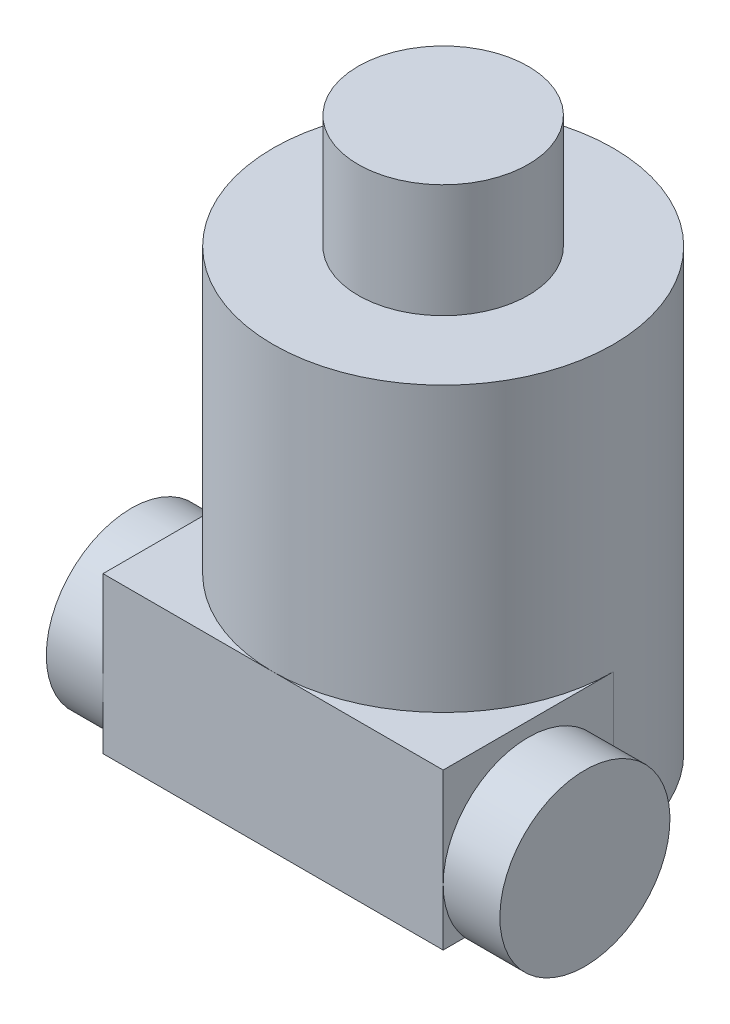
ISO-10303-21;
HEADER;
FILE_DESCRIPTION(('STEP AP214'),'2;1');
FILE_NAME('part.step','',(''),(''),'','','');
FILE_SCHEMA(('AUTOMOTIVE_DESIGN { 1 0 10303 214 1 1 1 1 }'));
ENDSEC;
DATA;
#1=APPLICATION_CONTEXT('core data for automotive mechanical design processes');
#2=APPLICATION_PROTOCOL_DEFINITION('international standard','automotive_design',2000,#1);
#3=PRODUCT_CONTEXT('',#1,'mechanical');
#4=PRODUCT('Part','Part','',(#3));
#5=PRODUCT_RELATED_PRODUCT_CATEGORY('part','',(#4));
#6=PRODUCT_DEFINITION_FORMATION('','',#4);
#7=PRODUCT_DEFINITION_CONTEXT('part definition',#1,'design');
#8=PRODUCT_DEFINITION('design','',#6,#7);
#9=PRODUCT_DEFINITION_SHAPE('','',#8);
#10=(LENGTH_UNIT() NAMED_UNIT(*) SI_UNIT(.MILLI.,.METRE.));
#11=(NAMED_UNIT(*) PLANE_ANGLE_UNIT() SI_UNIT($,.RADIAN.));
#12=(NAMED_UNIT(*) SI_UNIT($,.STERADIAN.) SOLID_ANGLE_UNIT());
#13=UNCERTAINTY_MEASURE_WITH_UNIT(LENGTH_MEASURE(1.E-05),#10,'distance_accuracy_value','');
#14=(GEOMETRIC_REPRESENTATION_CONTEXT(3) GLOBAL_UNCERTAINTY_ASSIGNED_CONTEXT((#13)) GLOBAL_UNIT_ASSIGNED_CONTEXT((#10,
#11,#12)) REPRESENTATION_CONTEXT('',''));
#15=CARTESIAN_POINT('',(0.,0.,0.));
#16=DIRECTION('',(0.,0.,1.));
#17=DIRECTION('',(1.,0.,0.));
#18=AXIS2_PLACEMENT_3D('',#15,#16,#17);
#19=CARTESIAN_POINT('',(60.,55.,0.));
#20=DIRECTION('',(1.,0.,0.));
#21=DIRECTION('',(0.,1.,0.));
#22=AXIS2_PLACEMENT_3D('',#19,#20,#21);
#23=PLANE('',#22);
#24=CARTESIAN_POINT('',(60.,20.,30.));
#25=DIRECTION('',(-1.,0.,0.));
#26=DIRECTION('',(0.,-1.,0.));
#27=AXIS2_PLACEMENT_3D('',#24,#25,#26);
#28=CIRCLE('',#27,30.);
#29=CARTESIAN_POINT('',(60.,0.,52.3606797749979));
#30=VERTEX_POINT('',#29);
#31=CARTESIAN_POINT('',(60.,20.,60.));
#32=VERTEX_POINT('',#31);
#33=EDGE_CURVE('E129',#30,#32,#28,.T.);
#34=ORIENTED_EDGE('',*,*,#33,.T.);
#35=DIRECTION('',(0.,-1.,0.));
#36=VECTOR('',#35,1.);
#37=CARTESIAN_POINT('',(60.,55.,60.));
#38=LINE('',#37,#36);
#39=CARTESIAN_POINT('',(60.,0.,60.));
#40=VERTEX_POINT('',#39);
#41=EDGE_CURVE('E119',#32,#40,#38,.T.);
#42=ORIENTED_EDGE('',*,*,#41,.T.);
#43=DIRECTION('',(0.,0.,1.));
#44=VECTOR('',#43,1.);
#45=CARTESIAN_POINT('',(60.,0.,0.));
#46=LINE('',#45,#44);
#47=EDGE_CURVE('E64',#30,#40,#46,.T.);
#48=ORIENTED_EDGE('',*,*,#47,.F.);
#49=EDGE_LOOP('',(#34,#42,#48));
#50=FACE_BOUND('',#49,.T.);
#51=ADVANCED_FACE('F41',(#50),#23,.T.);
#52=CARTESIAN_POINT('',(60.,20.,30.));
#53=DIRECTION('',(1.,0.,0.));
#54=DIRECTION('',(0.,1.,0.));
#55=AXIS2_PLACEMENT_3D('',#52,#53,#54);
#56=CIRCLE('',#55,30.);
#57=CARTESIAN_POINT('',(60.,0.,7.63932022500209));
#58=VERTEX_POINT('',#57);
#59=CARTESIAN_POINT('',(60.,20.,0.));
#60=VERTEX_POINT('',#59);
#61=EDGE_CURVE('E11',#58,#60,#56,.T.);
#62=ORIENTED_EDGE('',*,*,#61,.F.);
#63=CARTESIAN_POINT('',(60.,0.,0.));
#64=VERTEX_POINT('',#63);
#65=EDGE_CURVE('E185',#64,#58,#46,.T.);
#66=ORIENTED_EDGE('',*,*,#65,.F.);
#67=DIRECTION('',(0.,-1.,0.));
#68=VECTOR('',#67,1.);
#69=CARTESIAN_POINT('',(60.,55.,0.));
#70=LINE('',#69,#68);
#71=EDGE_CURVE('E175',#60,#64,#70,.T.);
#72=ORIENTED_EDGE('',*,*,#71,.F.);
#73=EDGE_LOOP('',(#62,#66,#72));
#74=FACE_BOUND('',#73,.T.);
#75=ADVANCED_FACE('F259',(#74),#23,.T.);
#76=CARTESIAN_POINT('',(-60.,55.,0.));
#77=DIRECTION('',(-1.,0.,0.));
#78=DIRECTION('',(0.,-1.,0.));
#79=AXIS2_PLACEMENT_3D('',#76,#77,#78);
#80=PLANE('',#79);
#81=DIRECTION('',(0.,0.,-1.));
#82=VECTOR('',#81,1.);
#83=CARTESIAN_POINT('',(-60.,0.,0.));
#84=LINE('',#83,#82);
#85=CARTESIAN_POINT('',(-60.,0.,7.63932022500209));
#86=VERTEX_POINT('',#85);
#87=CARTESIAN_POINT('',(-60.,0.,0.));
#88=VERTEX_POINT('',#87);
#89=EDGE_CURVE('E195',#86,#88,#84,.T.);
#90=ORIENTED_EDGE('',*,*,#89,.F.);
#91=CARTESIAN_POINT('',(-60.,20.,30.));
#92=DIRECTION('',(-1.,0.,0.));
#93=DIRECTION('',(0.,-1.,0.));
#94=AXIS2_PLACEMENT_3D('',#91,#92,#93);
#95=CIRCLE('',#94,30.);
#96=CARTESIAN_POINT('',(-60.,20.,0.));
#97=VERTEX_POINT('',#96);
#98=EDGE_CURVE('E138',#86,#97,#95,.F.);
#99=ORIENTED_EDGE('',*,*,#98,.T.);
#100=DIRECTION('',(0.,-1.,0.));
#101=VECTOR('',#100,1.);
#102=CARTESIAN_POINT('',(-60.,55.,0.));
#103=LINE('',#102,#101);
#104=EDGE_CURVE('E176',#97,#88,#103,.T.);
#105=ORIENTED_EDGE('',*,*,#104,.T.);
#106=EDGE_LOOP('',(#90,#99,#105));
#107=FACE_BOUND('',#106,.T.);
#108=ADVANCED_FACE('F255',(#107),#80,.T.);
#109=CARTESIAN_POINT('',(-60.,55.,0.));
#110=VERTEX_POINT('',#109);
#111=EDGE_CURVE('E171',#110,#97,#103,.T.);
#112=ORIENTED_EDGE('',*,*,#111,.T.);
#113=CARTESIAN_POINT('',(-60.,20.,60.));
#114=VERTEX_POINT('',#113);
#115=EDGE_CURVE('E141',#97,#114,#95,.F.);
#116=ORIENTED_EDGE('',*,*,#115,.T.);
#117=DIRECTION('',(0.,-1.,0.));
#118=VECTOR('',#117,1.);
#119=CARTESIAN_POINT('',(-60.,55.,60.));
#120=LINE('',#119,#118);
#121=CARTESIAN_POINT('',(-60.,55.,60.));
#122=VERTEX_POINT('',#121);
#123=EDGE_CURVE('E170',#122,#114,#120,.T.);
#124=ORIENTED_EDGE('',*,*,#123,.F.);
#125=DIRECTION('',(0.,0.,-1.));
#126=VECTOR('',#125,1.);
#127=CARTESIAN_POINT('',(-60.,55.,0.));
#128=LINE('',#127,#126);
#129=EDGE_CURVE('E184',#122,#110,#128,.T.);
#130=ORIENTED_EDGE('',*,*,#129,.T.);
#131=EDGE_LOOP('',(#112,#116,#124,#130));
#132=FACE_BOUND('',#131,.T.);
#133=ADVANCED_FACE('F252',(#132),#80,.T.);
#134=CARTESIAN_POINT('',(0.,0.,0.));
#135=DIRECTION('',(0.,-1.,0.));
#136=DIRECTION('',(1.,0.,0.));
#137=AXIS2_PLACEMENT_3D('',#134,#135,#136);
#138=PLANE('',#137);
#139=CARTESIAN_POINT('',(0.,0.,0.));
#140=DIRECTION('',(0.,1.,0.));
#141=DIRECTION('',(-1.,0.,0.));
#142=AXIS2_PLACEMENT_3D('',#139,#140,#141);
#143=CIRCLE('',#142,60.);
#144=EDGE_CURVE('E154',#64,#88,#143,.T.);
#145=ORIENTED_EDGE('',*,*,#144,.F.);
#146=ORIENTED_EDGE('',*,*,#65,.T.);
#147=EDGE_CURVE('E189',#58,#30,#46,.T.);
#148=ORIENTED_EDGE('',*,*,#147,.T.);
#149=ORIENTED_EDGE('',*,*,#47,.T.);
#150=DIRECTION('',(-1.,0.,0.));
#151=VECTOR('',#150,1.);
#152=CARTESIAN_POINT('',(-60.,0.,60.));
#153=LINE('',#152,#151);
#154=CARTESIAN_POINT('',(-60.,0.,60.));
#155=VERTEX_POINT('',#154);
#156=EDGE_CURVE('E125',#40,#155,#153,.T.);
#157=ORIENTED_EDGE('',*,*,#156,.T.);
#158=CARTESIAN_POINT('',(-60.,0.,52.3606797749979));
#159=VERTEX_POINT('',#158);
#160=EDGE_CURVE('E190',#155,#159,#84,.T.);
#161=ORIENTED_EDGE('',*,*,#160,.T.);
#162=EDGE_CURVE('E194',#159,#86,#84,.T.);
#163=ORIENTED_EDGE('',*,*,#162,.T.);
#164=ORIENTED_EDGE('',*,*,#89,.T.);
#165=EDGE_LOOP('',(#145,#146,#148,#149,#157,#161,#163,#164));
#166=FACE_BOUND('',#165,.T.);
#167=ADVANCED_FACE('F43',(#166),#138,.T.);
#168=CARTESIAN_POINT('',(0.,195.,0.));
#169=DIRECTION('',(0.,1.,0.));
#170=DIRECTION('',(-1.,0.,0.));
#171=AXIS2_PLACEMENT_3D('',#168,#169,#170);
#172=CYLINDRICAL_SURFACE('',#171,60.);
#173=ORIENTED_EDGE('',*,*,#111,.F.);
#174=CARTESIAN_POINT('',(0.,55.,0.));
#175=DIRECTION('',(0.,1.,0.));
#176=DIRECTION('',(-1.,0.,0.));
#177=AXIS2_PLACEMENT_3D('',#174,#175,#176);
#178=CIRCLE('',#177,60.);
#179=CARTESIAN_POINT('',(0.,55.,60.));
#180=VERTEX_POINT('',#179);
#181=EDGE_CURVE('E150',#180,#110,#178,.F.);
#182=ORIENTED_EDGE('',*,*,#181,.F.);
#183=CARTESIAN_POINT('',(60.,55.,0.));
#184=VERTEX_POINT('',#183);
#185=EDGE_CURVE('E148',#184,#180,#178,.F.);
#186=ORIENTED_EDGE('',*,*,#185,.F.);
#187=EDGE_CURVE('E127',#184,#60,#70,.T.);
#188=ORIENTED_EDGE('',*,*,#187,.T.);
#189=ORIENTED_EDGE('',*,*,#71,.T.);
#190=ORIENTED_EDGE('',*,*,#144,.T.);
#191=ORIENTED_EDGE('',*,*,#104,.F.);
#192=EDGE_LOOP('',(#173,#182,#186,#188,#189,#190,#191));
#193=FACE_BOUND('',#192,.T.);
#194=CARTESIAN_POINT('',(0.,155.,0.));
#195=DIRECTION('',(0.,1.,0.));
#196=DIRECTION('',(-1.,0.,0.));
#197=AXIS2_PLACEMENT_3D('',#194,#195,#196);
#198=CIRCLE('',#197,60.);
#199=CARTESIAN_POINT('',(-60.,155.,0.));
#200=VERTEX_POINT('',#199);
#201=EDGE_CURVE('E158',#200,#200,#198,.T.);
#202=ORIENTED_EDGE('',*,*,#201,.F.);
#203=EDGE_LOOP('',(#202));
#204=FACE_BOUND('',#203,.T.);
#205=ADVANCED_FACE('F253',(#193,#204),#172,.T.);
#206=CARTESIAN_POINT('',(-60.,155.,0.));
#207=DIRECTION('',(0.,1.,0.));
#208=DIRECTION('',(-1.,0.,0.));
#209=AXIS2_PLACEMENT_3D('',#206,#207,#208);
#210=PLANE('',#209);
#211=ORIENTED_EDGE('',*,*,#201,.T.);
#212=EDGE_LOOP('',(#211));
#213=FACE_BOUND('',#212,.T.);
#214=CARTESIAN_POINT('',(0.,155.,0.));
#215=DIRECTION('',(0.,1.,0.));
#216=DIRECTION('',(-1.,0.,0.));
#217=AXIS2_PLACEMENT_3D('',#214,#215,#216);
#218=CIRCLE('',#217,30.);
#219=CARTESIAN_POINT('',(-30.,155.,0.));
#220=VERTEX_POINT('',#219);
#221=EDGE_CURVE('E162',#220,#220,#218,.T.);
#222=ORIENTED_EDGE('',*,*,#221,.F.);
#223=EDGE_LOOP('',(#222));
#224=FACE_BOUND('',#223,.T.);
#225=ADVANCED_FACE('F285',(#213,#224),#210,.T.);
#226=CARTESIAN_POINT('',(0.,195.,0.));
#227=DIRECTION('',(0.,1.,0.));
#228=DIRECTION('',(-1.,0.,0.));
#229=AXIS2_PLACEMENT_3D('',#226,#227,#228);
#230=CYLINDRICAL_SURFACE('',#229,30.);
#231=ORIENTED_EDGE('',*,*,#221,.T.);
#232=EDGE_LOOP('',(#231));
#233=FACE_BOUND('',#232,.T.);
#234=CARTESIAN_POINT('',(0.,195.,0.));
#235=DIRECTION('',(0.,1.,0.));
#236=DIRECTION('',(-1.,0.,0.));
#237=AXIS2_PLACEMENT_3D('',#234,#235,#236);
#238=CIRCLE('',#237,30.);
#239=CARTESIAN_POINT('',(-30.,195.,0.));
#240=VERTEX_POINT('',#239);
#241=EDGE_CURVE('E166',#240,#240,#238,.T.);
#242=ORIENTED_EDGE('',*,*,#241,.F.);
#243=EDGE_LOOP('',(#242));
#244=FACE_BOUND('',#243,.T.);
#245=ADVANCED_FACE('F289',(#233,#244),#230,.T.);
#246=CARTESIAN_POINT('',(-30.,195.,0.));
#247=DIRECTION('',(0.,1.,0.));
#248=DIRECTION('',(-1.,0.,0.));
#249=AXIS2_PLACEMENT_3D('',#246,#247,#248);
#250=PLANE('',#249);
#251=ORIENTED_EDGE('',*,*,#241,.T.);
#252=EDGE_LOOP('',(#251));
#253=FACE_BOUND('',#252,.T.);
#254=ADVANCED_FACE('F294',(#253),#250,.T.);
#255=CARTESIAN_POINT('',(-60.,55.,60.));
#256=DIRECTION('',(0.,0.,1.));
#257=DIRECTION('',(1.,0.,0.));
#258=AXIS2_PLACEMENT_3D('',#255,#256,#257);
#259=PLANE('',#258);
#260=ORIENTED_EDGE('',*,*,#123,.T.);
#261=EDGE_CURVE('E118',#114,#155,#120,.T.);
#262=ORIENTED_EDGE('',*,*,#261,.T.);
#263=ORIENTED_EDGE('',*,*,#156,.F.);
#264=ORIENTED_EDGE('',*,*,#41,.F.);
#265=CARTESIAN_POINT('',(60.,55.,60.));
#266=VERTEX_POINT('',#265);
#267=EDGE_CURVE('E109',#266,#32,#38,.T.);
#268=ORIENTED_EDGE('',*,*,#267,.F.);
#269=DIRECTION('',(-1.,0.,0.));
#270=VECTOR('',#269,1.);
#271=CARTESIAN_POINT('',(-60.,55.,60.));
#272=LINE('',#271,#270);
#273=EDGE_CURVE('E196',#266,#180,#272,.T.);
#274=ORIENTED_EDGE('',*,*,#273,.T.);
#275=EDGE_CURVE('E199',#180,#122,#272,.T.);
#276=ORIENTED_EDGE('',*,*,#275,.T.);
#277=EDGE_LOOP('',(#260,#262,#263,#264,#268,#274,#276));
#278=FACE_BOUND('',#277,.T.);
#279=ADVANCED_FACE('F123',(#278),#259,.T.);
#280=CARTESIAN_POINT('',(0.,55.,0.));
#281=DIRECTION('',(0.,1.,0.));
#282=DIRECTION('',(-1.,0.,0.));
#283=AXIS2_PLACEMENT_3D('',#280,#281,#282);
#284=PLANE('',#283);
#285=DIRECTION('',(0.,0.,1.));
#286=VECTOR('',#285,1.);
#287=CARTESIAN_POINT('',(60.,55.,0.));
#288=LINE('',#287,#286);
#289=EDGE_CURVE('E113',#184,#266,#288,.T.);
#290=ORIENTED_EDGE('',*,*,#289,.F.);
#291=ORIENTED_EDGE('',*,*,#185,.T.);
#292=ORIENTED_EDGE('',*,*,#273,.F.);
#293=EDGE_LOOP('',(#290,#291,#292));
#294=FACE_BOUND('',#293,.T.);
#295=ADVANCED_FACE('F245',(#294),#284,.T.);
#296=ORIENTED_EDGE('',*,*,#261,.F.);
#297=CARTESIAN_POINT('',(-60.,20.,30.));
#298=DIRECTION('',(-1.,0.,0.));
#299=DIRECTION('',(0.,-1.,0.));
#300=AXIS2_PLACEMENT_3D('',#297,#298,#299);
#301=CIRCLE('',#300,30.);
#302=EDGE_CURVE('E205',#159,#114,#301,.T.);
#303=ORIENTED_EDGE('',*,*,#302,.F.);
#304=ORIENTED_EDGE('',*,*,#160,.F.);
#305=EDGE_LOOP('',(#296,#303,#304));
#306=FACE_BOUND('',#305,.T.);
#307=ADVANCED_FACE('F231',(#306),#80,.T.);
#308=EDGE_CURVE('E45',#60,#32,#56,.T.);
#309=ORIENTED_EDGE('',*,*,#308,.F.);
#310=ORIENTED_EDGE('',*,*,#187,.F.);
#311=ORIENTED_EDGE('',*,*,#289,.T.);
#312=ORIENTED_EDGE('',*,*,#267,.T.);
#313=EDGE_LOOP('',(#309,#310,#311,#312));
#314=FACE_BOUND('',#313,.T.);
#315=ADVANCED_FACE('F111',(#314),#23,.T.);
#316=ORIENTED_EDGE('',*,*,#275,.F.);
#317=ORIENTED_EDGE('',*,*,#181,.T.);
#318=ORIENTED_EDGE('',*,*,#129,.F.);
#319=EDGE_LOOP('',(#316,#317,#318));
#320=FACE_BOUND('',#319,.T.);
#321=ADVANCED_FACE('F249',(#320),#284,.T.);
#322=CARTESIAN_POINT('',(-80.,20.,30.));
#323=DIRECTION('',(1.,0.,0.));
#324=DIRECTION('',(0.,1.,0.));
#325=AXIS2_PLACEMENT_3D('',#322,#323,#324);
#326=CYLINDRICAL_SURFACE('',#325,30.);
#327=CARTESIAN_POINT('',(-80.,20.,30.));
#328=DIRECTION('',(-1.,0.,0.));
#329=DIRECTION('',(0.,-1.,0.));
#330=AXIS2_PLACEMENT_3D('',#327,#328,#329);
#331=CIRCLE('',#330,30.);
#332=CARTESIAN_POINT('',(-80.,-10.,30.));
#333=VERTEX_POINT('',#332);
#334=EDGE_CURVE('E208',#333,#333,#331,.T.);
#335=ORIENTED_EDGE('',*,*,#334,.F.);
#336=EDGE_LOOP('',(#335));
#337=FACE_BOUND('',#336,.T.);
#338=ORIENTED_EDGE('',*,*,#302,.T.);
#339=ORIENTED_EDGE('',*,*,#115,.F.);
#340=ORIENTED_EDGE('',*,*,#98,.F.);
#341=EDGE_CURVE('E209',#86,#159,#301,.T.);
#342=ORIENTED_EDGE('',*,*,#341,.T.);
#343=EDGE_LOOP('',(#338,#339,#340,#342));
#344=FACE_BOUND('',#343,.T.);
#345=ADVANCED_FACE('F220',(#337,#344),#326,.T.);
#346=CARTESIAN_POINT('',(-80.,20.,30.));
#347=DIRECTION('',(-1.,0.,0.));
#348=DIRECTION('',(0.,-1.,0.));
#349=AXIS2_PLACEMENT_3D('',#346,#347,#348);
#350=PLANE('',#349);
#351=ORIENTED_EDGE('',*,*,#334,.T.);
#352=EDGE_LOOP('',(#351));
#353=FACE_BOUND('',#352,.T.);
#354=ADVANCED_FACE('F308',(#353),#350,.T.);
#355=CARTESIAN_POINT('',(-60.,20.,30.));
#356=DIRECTION('',(-1.,0.,0.));
#357=DIRECTION('',(0.,-1.,0.));
#358=AXIS2_PLACEMENT_3D('',#355,#356,#357);
#359=PLANE('',#358);
#360=ORIENTED_EDGE('',*,*,#162,.F.);
#361=ORIENTED_EDGE('',*,*,#341,.F.);
#362=EDGE_LOOP('',(#360,#361));
#363=FACE_BOUND('',#362,.T.);
#364=ADVANCED_FACE('F224',(#363),#359,.F.);
#365=CARTESIAN_POINT('',(80.,20.,30.));
#366=DIRECTION('',(-1.,0.,0.));
#367=DIRECTION('',(0.,-1.,0.));
#368=AXIS2_PLACEMENT_3D('',#365,#366,#367);
#369=CYLINDRICAL_SURFACE('',#368,30.);
#370=CARTESIAN_POINT('',(80.,20.,30.));
#371=DIRECTION('',(-1.,0.,0.));
#372=DIRECTION('',(0.,-1.,0.));
#373=AXIS2_PLACEMENT_3D('',#370,#371,#372);
#374=CIRCLE('',#373,30.);
#375=CARTESIAN_POINT('',(80.,-10.,30.));
#376=VERTEX_POINT('',#375);
#377=EDGE_CURVE('E133',#376,#376,#374,.T.);
#378=ORIENTED_EDGE('',*,*,#377,.T.);
#379=EDGE_LOOP('',(#378));
#380=FACE_BOUND('',#379,.T.);
#381=ORIENTED_EDGE('',*,*,#33,.F.);
#382=EDGE_CURVE('E134',#58,#30,#28,.T.);
#383=ORIENTED_EDGE('',*,*,#382,.F.);
#384=ORIENTED_EDGE('',*,*,#61,.T.);
#385=ORIENTED_EDGE('',*,*,#308,.T.);
#386=EDGE_LOOP('',(#381,#383,#384,#385));
#387=FACE_BOUND('',#386,.T.);
#388=ADVANCED_FACE('F136',(#380,#387),#369,.T.);
#389=CARTESIAN_POINT('',(80.,20.,30.));
#390=DIRECTION('',(1.,0.,0.));
#391=DIRECTION('',(0.,-1.,0.));
#392=AXIS2_PLACEMENT_3D('',#389,#390,#391);
#393=PLANE('',#392);
#394=ORIENTED_EDGE('',*,*,#377,.F.);
#395=EDGE_LOOP('',(#394));
#396=FACE_BOUND('',#395,.T.);
#397=ADVANCED_FACE('F317',(#396),#393,.T.);
#398=CARTESIAN_POINT('',(60.,20.,30.));
#399=DIRECTION('',(1.,0.,0.));
#400=DIRECTION('',(0.,-1.,0.));
#401=AXIS2_PLACEMENT_3D('',#398,#399,#400);
#402=PLANE('',#401);
#403=ORIENTED_EDGE('',*,*,#147,.F.);
#404=ORIENTED_EDGE('',*,*,#382,.T.);
#405=EDGE_LOOP('',(#403,#404));
#406=FACE_BOUND('',#405,.T.);
#407=ADVANCED_FACE('F318',(#406),#402,.F.);
#408=CLOSED_SHELL('',(#51,#75,#108,#133,#167,#205,#225,#245,#254,#279,#295,#307,#315,#321,#345,
#354,#364,#388,#397,#407));
#409=MANIFOLD_SOLID_BREP('B2',#408);
#410=ADVANCED_BREP_SHAPE_REPRESENTATION('',(#18,#409),#14);
#411=SHAPE_DEFINITION_REPRESENTATION(#9,#410);
ENDSEC;
END-ISO-10303-21;
